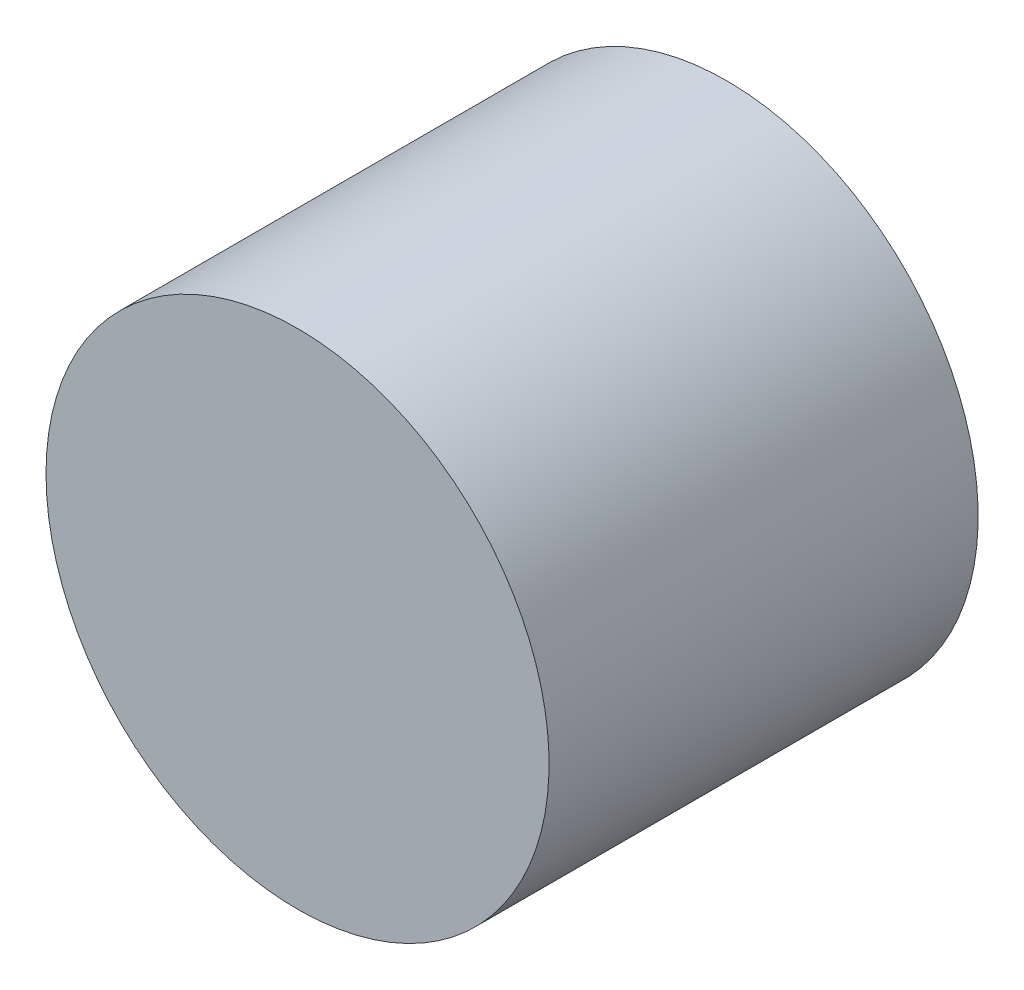
ISO-10303-21;
HEADER;
FILE_DESCRIPTION(('STEP AP214'),'2;1');
FILE_NAME('part.step','',(''),(''),'','','');
FILE_SCHEMA(('AUTOMOTIVE_DESIGN { 1 0 10303 214 1 1 1 1 }'));
ENDSEC;
DATA;
#1=APPLICATION_CONTEXT('core data for automotive mechanical design processes');
#2=APPLICATION_PROTOCOL_DEFINITION('international standard','automotive_design',2000,#1);
#3=PRODUCT_CONTEXT('',#1,'mechanical');
#4=PRODUCT('Part','Part','',(#3));
#5=PRODUCT_RELATED_PRODUCT_CATEGORY('part','',(#4));
#6=PRODUCT_DEFINITION_FORMATION('','',#4);
#7=PRODUCT_DEFINITION_CONTEXT('part definition',#1,'design');
#8=PRODUCT_DEFINITION('design','',#6,#7);
#9=PRODUCT_DEFINITION_SHAPE('','',#8);
#10=(LENGTH_UNIT() NAMED_UNIT(*) SI_UNIT(.MILLI.,.METRE.));
#11=(NAMED_UNIT(*) PLANE_ANGLE_UNIT() SI_UNIT($,.RADIAN.));
#12=(NAMED_UNIT(*) SI_UNIT($,.STERADIAN.) SOLID_ANGLE_UNIT());
#13=UNCERTAINTY_MEASURE_WITH_UNIT(LENGTH_MEASURE(1.E-05),#10,'distance_accuracy_value','');
#14=(GEOMETRIC_REPRESENTATION_CONTEXT(3) GLOBAL_UNCERTAINTY_ASSIGNED_CONTEXT((#13)) GLOBAL_UNIT_ASSIGNED_CONTEXT((#10,
#11,#12)) REPRESENTATION_CONTEXT('',''));
#15=CARTESIAN_POINT('',(0.,0.,0.));
#16=DIRECTION('',(0.,0.,1.));
#17=DIRECTION('',(1.,0.,0.));
#18=AXIS2_PLACEMENT_3D('',#15,#16,#17);
#19=CARTESIAN_POINT('',(3.40000082,0.,0.));
#20=DIRECTION('',(0.,0.,-1.));
#21=DIRECTION('',(-1.,0.,0.));
#22=AXIS2_PLACEMENT_3D('',#19,#20,#21);
#23=PLANE('',#22);
#24=CARTESIAN_POINT('',(0.,0.,0.));
#25=DIRECTION('',(0.,0.,-1.));
#26=DIRECTION('',(-1.,0.,0.));
#27=AXIS2_PLACEMENT_3D('',#24,#25,#26);
#28=CIRCLE('',#27,3.40000082);
#29=CARTESIAN_POINT('',(-3.40000082,0.,0.));
#30=VERTEX_POINT('',#29);
#31=EDGE_CURVE('E18',#30,#30,#28,.F.);
#32=ORIENTED_EDGE('',*,*,#31,.F.);
#33=EDGE_LOOP('',(#32));
#34=FACE_BOUND('',#33,.T.);
#35=ADVANCED_FACE('F15',(#34),#23,.T.);
#36=CARTESIAN_POINT('',(3.40000082,0.,5.8000011));
#37=DIRECTION('',(0.,0.,-1.));
#38=DIRECTION('',(-1.,0.,0.));
#39=AXIS2_PLACEMENT_3D('',#36,#37,#38);
#40=PLANE('',#39);
#41=CARTESIAN_POINT('',(0.,0.,5.8000011));
#42=DIRECTION('',(0.,0.,-1.));
#43=DIRECTION('',(-1.,0.,0.));
#44=AXIS2_PLACEMENT_3D('',#41,#42,#43);
#45=CIRCLE('',#44,3.40000082);
#46=CARTESIAN_POINT('',(-3.40000082,0.,5.8000011));
#47=VERTEX_POINT('',#46);
#48=EDGE_CURVE('E10',#47,#47,#45,.T.);
#49=ORIENTED_EDGE('',*,*,#48,.F.);
#50=EDGE_LOOP('',(#49));
#51=FACE_BOUND('',#50,.T.);
#52=ADVANCED_FACE('F30',(#51),#40,.F.);
#53=CARTESIAN_POINT('',(0.,0.,0.));
#54=DIRECTION('',(0.,0.,-1.));
#55=DIRECTION('',(-1.,0.,0.));
#56=AXIS2_PLACEMENT_3D('',#53,#54,#55);
#57=CYLINDRICAL_SURFACE('',#56,3.40000082);
#58=ORIENTED_EDGE('',*,*,#48,.T.);
#59=EDGE_LOOP('',(#58));
#60=FACE_BOUND('',#59,.T.);
#61=ORIENTED_EDGE('',*,*,#31,.T.);
#62=EDGE_LOOP('',(#61));
#63=FACE_BOUND('',#62,.T.);
#64=ADVANCED_FACE('F27',(#60,#63),#57,.T.);
#65=CLOSED_SHELL('',(#35,#52,#64));
#66=MANIFOLD_SOLID_BREP('B1',#65);
#67=ADVANCED_BREP_SHAPE_REPRESENTATION('',(#18,#66),#14);
#68=SHAPE_DEFINITION_REPRESENTATION(#9,#67);
ENDSEC;
END-ISO-10303-21;
